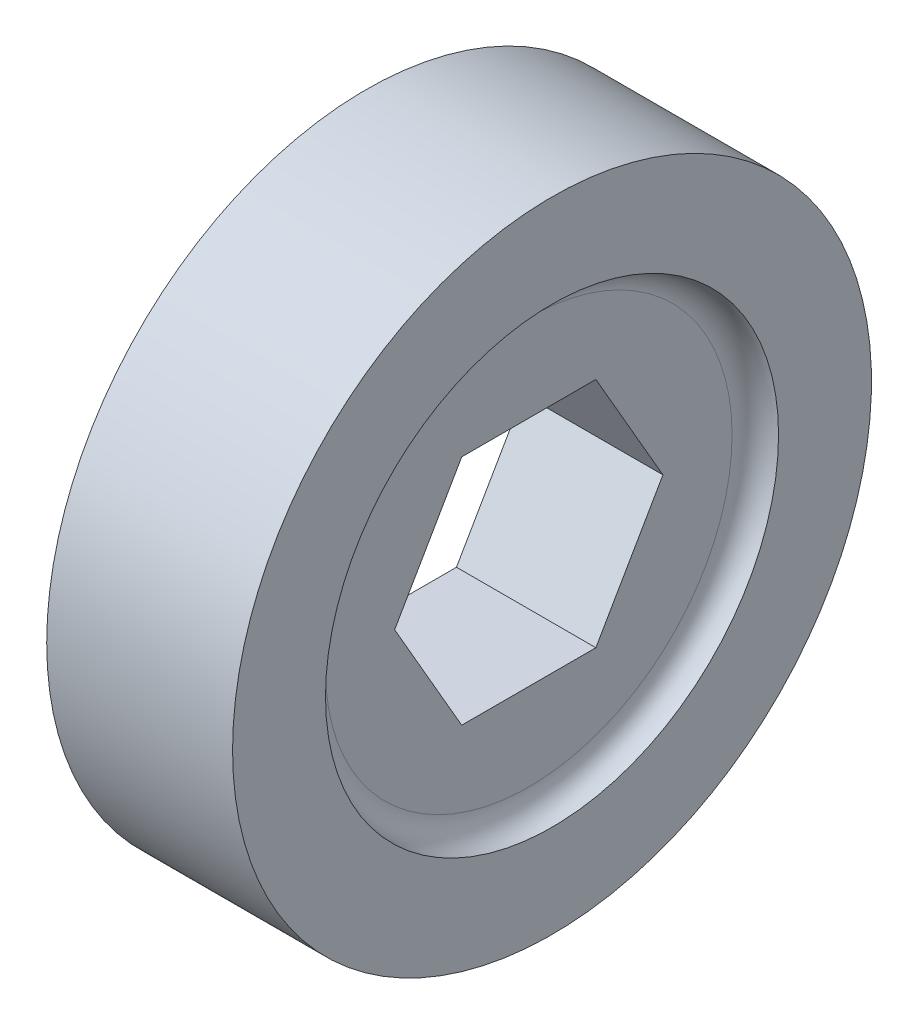
ISO-10303-21;
HEADER;
FILE_DESCRIPTION(('STEP AP214'),'2;1');
FILE_NAME('part.step','',(''),(''),'','','');
FILE_SCHEMA(('AUTOMOTIVE_DESIGN { 1 0 10303 214 1 1 1 1 }'));
ENDSEC;
DATA;
#1=APPLICATION_CONTEXT('core data for automotive mechanical design processes');
#2=APPLICATION_PROTOCOL_DEFINITION('international standard','automotive_design',2000,#1);
#3=PRODUCT_CONTEXT('',#1,'mechanical');
#4=PRODUCT('Part','Part','',(#3));
#5=PRODUCT_RELATED_PRODUCT_CATEGORY('part','',(#4));
#6=PRODUCT_DEFINITION_FORMATION('','',#4);
#7=PRODUCT_DEFINITION_CONTEXT('part definition',#1,'design');
#8=PRODUCT_DEFINITION('design','',#6,#7);
#9=PRODUCT_DEFINITION_SHAPE('','',#8);
#10=(LENGTH_UNIT() NAMED_UNIT(*) SI_UNIT(.MILLI.,.METRE.));
#11=(NAMED_UNIT(*) PLANE_ANGLE_UNIT() SI_UNIT($,.RADIAN.));
#12=(NAMED_UNIT(*) SI_UNIT($,.STERADIAN.) SOLID_ANGLE_UNIT());
#13=UNCERTAINTY_MEASURE_WITH_UNIT(LENGTH_MEASURE(1.E-05),#10,'distance_accuracy_value','');
#14=(GEOMETRIC_REPRESENTATION_CONTEXT(3) GLOBAL_UNCERTAINTY_ASSIGNED_CONTEXT((#13)) GLOBAL_UNIT_ASSIGNED_CONTEXT((#10,
#11,#12)) REPRESENTATION_CONTEXT('',''));
#15=CARTESIAN_POINT('',(0.,0.,0.));
#16=DIRECTION('',(0.,0.,1.));
#17=DIRECTION('',(1.,0.,0.));
#18=AXIS2_PLACEMENT_3D('',#15,#16,#17);
#19=CARTESIAN_POINT('',(-5.08,0.,0.));
#20=DIRECTION('',(1.,0.,0.));
#21=DIRECTION('',(0.,0.,-1.));
#22=AXIS2_PLACEMENT_3D('',#19,#20,#21);
#23=PLANE('',#22);
#24=CARTESIAN_POINT('',(-5.08,0.,0.));
#25=DIRECTION('',(-1.,0.,0.));
#26=DIRECTION('',(0.,0.,1.));
#27=AXIS2_PLACEMENT_3D('',#24,#25,#26);
#28=CIRCLE('',#27,12.3825);
#29=CARTESIAN_POINT('',(-5.08,0.,12.3825));
#30=VERTEX_POINT('',#29);
#31=EDGE_CURVE('E11',#30,#30,#28,.T.);
#32=ORIENTED_EDGE('',*,*,#31,.F.);
#33=EDGE_LOOP('',(#32));
#34=FACE_BOUND('',#33,.T.);
#35=CARTESIAN_POINT('',(-5.08,0.,0.));
#36=DIRECTION('',(-1.,0.,0.));
#37=DIRECTION('',(0.,0.,1.));
#38=AXIS2_PLACEMENT_3D('',#35,#36,#37);
#39=CIRCLE('',#38,17.4625);
#40=CARTESIAN_POINT('',(-5.08,0.,17.4625));
#41=VERTEX_POINT('',#40);
#42=EDGE_CURVE('E105',#41,#41,#39,.T.);
#43=ORIENTED_EDGE('',*,*,#42,.T.);
#44=EDGE_LOOP('',(#43));
#45=FACE_BOUND('',#44,.T.);
#46=ADVANCED_FACE('F39',(#34,#45),#23,.F.);
#47=CARTESIAN_POINT('',(-5.08,0.,0.));
#48=DIRECTION('',(-1.,0.,0.));
#49=DIRECTION('',(0.,0.,1.));
#50=AXIS2_PLACEMENT_3D('',#47,#48,#49);
#51=TOROIDAL_SURFACE('',#50,11.1125,1.27);
#52=CARTESIAN_POINT('',(-3.81,0.,0.));
#53=DIRECTION('',(-1.,0.,0.));
#54=DIRECTION('',(0.,0.,1.));
#55=AXIS2_PLACEMENT_3D('',#52,#53,#54);
#56=CIRCLE('',#55,11.1125);
#57=CARTESIAN_POINT('',(-3.81,0.,11.1125));
#58=VERTEX_POINT('',#57);
#59=EDGE_CURVE('E46',#58,#58,#56,.T.);
#60=ORIENTED_EDGE('',*,*,#59,.F.);
#61=EDGE_LOOP('',(#60));
#62=FACE_BOUND('',#61,.T.);
#63=ORIENTED_EDGE('',*,*,#31,.T.);
#64=EDGE_LOOP('',(#63));
#65=FACE_BOUND('',#64,.T.);
#66=ADVANCED_FACE('F153',(#62,#65),#51,.F.);
#67=CARTESIAN_POINT('',(-3.81,0.,0.));
#68=DIRECTION('',(1.,0.,0.));
#69=DIRECTION('',(0.,0.,-1.));
#70=AXIS2_PLACEMENT_3D('',#67,#68,#69);
#71=PLANE('',#70);
#72=DIRECTION('',(0.,0.,1.));
#73=VECTOR('',#72,1.);
#74=CARTESIAN_POINT('',(-3.81,-6.35,3.66617420935412));
#75=LINE('',#74,#73);
#76=CARTESIAN_POINT('',(-3.81,-6.35,-3.66617420935412));
#77=VERTEX_POINT('',#76);
#78=CARTESIAN_POINT('',(-3.81,-6.35,3.66617420935412));
#79=VERTEX_POINT('',#78);
#80=EDGE_CURVE('E112',#77,#79,#75,.T.);
#81=ORIENTED_EDGE('',*,*,#80,.F.);
#82=DIRECTION('',(0.,-0.866025403784439,0.5));
#83=VECTOR('',#82,1.);
#84=CARTESIAN_POINT('',(-3.81,-6.35,-3.66617420935412));
#85=LINE('',#84,#83);
#86=CARTESIAN_POINT('',(-3.81,0.,-7.33234841870825));
#87=VERTEX_POINT('',#86);
#88=EDGE_CURVE('E93',#87,#77,#85,.T.);
#89=ORIENTED_EDGE('',*,*,#88,.F.);
#90=DIRECTION('',(0.,-0.866025403784439,-0.5));
#91=VECTOR('',#90,1.);
#92=CARTESIAN_POINT('',(-3.81,0.,-7.33234841870825));
#93=LINE('',#92,#91);
#94=CARTESIAN_POINT('',(-3.81,6.35,-3.66617420935412));
#95=VERTEX_POINT('',#94);
#96=EDGE_CURVE('E102',#95,#87,#93,.T.);
#97=ORIENTED_EDGE('',*,*,#96,.F.);
#98=DIRECTION('',(0.,0.,-1.));
#99=VECTOR('',#98,1.);
#100=CARTESIAN_POINT('',(-3.81,6.35,-3.66617420935412));
#101=LINE('',#100,#99);
#102=CARTESIAN_POINT('',(-3.81,6.35,3.66617420935412));
#103=VERTEX_POINT('',#102);
#104=EDGE_CURVE('E53',#103,#95,#101,.T.);
#105=ORIENTED_EDGE('',*,*,#104,.F.);
#106=DIRECTION('',(0.,0.866025403784439,-0.5));
#107=VECTOR('',#106,1.);
#108=CARTESIAN_POINT('',(-3.81,6.35,3.66617420935412));
#109=LINE('',#108,#107);
#110=CARTESIAN_POINT('',(-3.81,0.,7.33234841870825));
#111=VERTEX_POINT('',#110);
#112=EDGE_CURVE('E285',#111,#103,#109,.T.);
#113=ORIENTED_EDGE('',*,*,#112,.F.);
#114=DIRECTION('',(0.,0.866025403784439,0.5));
#115=VECTOR('',#114,1.);
#116=CARTESIAN_POINT('',(-3.81,0.,7.33234841870825));
#117=LINE('',#116,#115);
#118=EDGE_CURVE('E116',#79,#111,#117,.T.);
#119=ORIENTED_EDGE('',*,*,#118,.F.);
#120=EDGE_LOOP('',(#81,#89,#97,#105,#113,#119));
#121=FACE_BOUND('',#120,.T.);
#122=ORIENTED_EDGE('',*,*,#59,.T.);
#123=EDGE_LOOP('',(#122));
#124=FACE_BOUND('',#123,.T.);
#125=ADVANCED_FACE('F108',(#121,#124),#71,.F.);
#126=CARTESIAN_POINT('',(3.81,0.,0.));
#127=DIRECTION('',(1.,0.,0.));
#128=DIRECTION('',(0.,0.,-1.));
#129=AXIS2_PLACEMENT_3D('',#126,#127,#128);
#130=PLANE('',#129);
#131=DIRECTION('',(0.,0.866025403784439,-0.5));
#132=VECTOR('',#131,1.);
#133=CARTESIAN_POINT('',(3.81,-6.35,-3.66617420935412));
#134=LINE('',#133,#132);
#135=CARTESIAN_POINT('',(3.81,-6.35,-3.66617420935412));
#136=VERTEX_POINT('',#135);
#137=CARTESIAN_POINT('',(3.81,0.,-7.33234841870825));
#138=VERTEX_POINT('',#137);
#139=EDGE_CURVE('E61',#136,#138,#134,.T.);
#140=ORIENTED_EDGE('',*,*,#139,.F.);
#141=DIRECTION('',(0.,0.,-1.));
#142=VECTOR('',#141,1.);
#143=CARTESIAN_POINT('',(3.81,-6.35,3.66617420935412));
#144=LINE('',#143,#142);
#145=CARTESIAN_POINT('',(3.81,-6.35,3.66617420935412));
#146=VERTEX_POINT('',#145);
#147=EDGE_CURVE('E99',#146,#136,#144,.T.);
#148=ORIENTED_EDGE('',*,*,#147,.F.);
#149=DIRECTION('',(0.,-0.866025403784439,-0.5));
#150=VECTOR('',#149,1.);
#151=CARTESIAN_POINT('',(3.81,0.,7.33234841870825));
#152=LINE('',#151,#150);
#153=CARTESIAN_POINT('',(3.81,0.,7.33234841870825));
#154=VERTEX_POINT('',#153);
#155=EDGE_CURVE('E127',#154,#146,#152,.T.);
#156=ORIENTED_EDGE('',*,*,#155,.F.);
#157=DIRECTION('',(0.,-0.866025403784439,0.5));
#158=VECTOR('',#157,1.);
#159=CARTESIAN_POINT('',(3.81,6.35,3.66617420935412));
#160=LINE('',#159,#158);
#161=CARTESIAN_POINT('',(3.81,6.35,3.66617420935412));
#162=VERTEX_POINT('',#161);
#163=EDGE_CURVE('E124',#162,#154,#160,.T.);
#164=ORIENTED_EDGE('',*,*,#163,.F.);
#165=DIRECTION('',(0.,0.,1.));
#166=VECTOR('',#165,1.);
#167=CARTESIAN_POINT('',(3.81,6.35,-3.66617420935412));
#168=LINE('',#167,#166);
#169=CARTESIAN_POINT('',(3.81,6.35,-3.66617420935412));
#170=VERTEX_POINT('',#169);
#171=EDGE_CURVE('E121',#170,#162,#168,.T.);
#172=ORIENTED_EDGE('',*,*,#171,.F.);
#173=DIRECTION('',(0.,0.866025403784438,0.5));
#174=VECTOR('',#173,1.);
#175=CARTESIAN_POINT('',(3.81,0.,-7.33234841870825));
#176=LINE('',#175,#174);
#177=EDGE_CURVE('E114',#138,#170,#176,.T.);
#178=ORIENTED_EDGE('',*,*,#177,.F.);
#179=EDGE_LOOP('',(#140,#148,#156,#164,#172,#178));
#180=FACE_BOUND('',#179,.T.);
#181=CARTESIAN_POINT('',(3.81,0.,0.));
#182=DIRECTION('',(-1.,0.,0.));
#183=DIRECTION('',(0.,0.,1.));
#184=AXIS2_PLACEMENT_3D('',#181,#182,#183);
#185=CIRCLE('',#184,11.1125);
#186=CARTESIAN_POINT('',(3.81,0.,11.1125));
#187=VERTEX_POINT('',#186);
#188=EDGE_CURVE('E148',#187,#187,#185,.T.);
#189=ORIENTED_EDGE('',*,*,#188,.F.);
#190=EDGE_LOOP('',(#189));
#191=FACE_BOUND('',#190,.T.);
#192=ADVANCED_FACE('F180',(#180,#191),#130,.T.);
#193=CARTESIAN_POINT('',(5.08,0.,0.));
#194=DIRECTION('',(-1.,0.,0.));
#195=DIRECTION('',(0.,0.,1.));
#196=AXIS2_PLACEMENT_3D('',#193,#194,#195);
#197=TOROIDAL_SURFACE('',#196,11.1125,1.27);
#198=ORIENTED_EDGE('',*,*,#188,.T.);
#199=EDGE_LOOP('',(#198));
#200=FACE_BOUND('',#199,.T.);
#201=CARTESIAN_POINT('',(5.08,0.,0.));
#202=DIRECTION('',(-1.,0.,0.));
#203=DIRECTION('',(0.,0.,1.));
#204=AXIS2_PLACEMENT_3D('',#201,#202,#203);
#205=CIRCLE('',#204,12.3825);
#206=CARTESIAN_POINT('',(5.08,0.,12.3825));
#207=VERTEX_POINT('',#206);
#208=EDGE_CURVE('E145',#207,#207,#205,.T.);
#209=ORIENTED_EDGE('',*,*,#208,.F.);
#210=EDGE_LOOP('',(#209));
#211=FACE_BOUND('',#210,.T.);
#212=ADVANCED_FACE('F173',(#200,#211),#197,.F.);
#213=CARTESIAN_POINT('',(5.08,0.,0.));
#214=DIRECTION('',(1.,0.,0.));
#215=DIRECTION('',(0.,0.,-1.));
#216=AXIS2_PLACEMENT_3D('',#213,#214,#215);
#217=PLANE('',#216);
#218=ORIENTED_EDGE('',*,*,#208,.T.);
#219=EDGE_LOOP('',(#218));
#220=FACE_BOUND('',#219,.T.);
#221=CARTESIAN_POINT('',(5.08,0.,0.));
#222=DIRECTION('',(-1.,0.,0.));
#223=DIRECTION('',(0.,0.,1.));
#224=AXIS2_PLACEMENT_3D('',#221,#222,#223);
#225=CIRCLE('',#224,17.4625);
#226=CARTESIAN_POINT('',(5.08,0.,17.4625));
#227=VERTEX_POINT('',#226);
#228=EDGE_CURVE('E142',#227,#227,#225,.T.);
#229=ORIENTED_EDGE('',*,*,#228,.F.);
#230=EDGE_LOOP('',(#229));
#231=FACE_BOUND('',#230,.T.);
#232=ADVANCED_FACE('F164',(#220,#231),#217,.T.);
#233=CARTESIAN_POINT('',(-6.86942909494839,0.,0.));
#234=DIRECTION('',(-1.,0.,0.));
#235=DIRECTION('',(0.,0.,1.));
#236=AXIS2_PLACEMENT_3D('',#233,#234,#235);
#237=CYLINDRICAL_SURFACE('',#236,17.4625);
#238=ORIENTED_EDGE('',*,*,#228,.T.);
#239=EDGE_LOOP('',(#238));
#240=FACE_BOUND('',#239,.T.);
#241=ORIENTED_EDGE('',*,*,#42,.F.);
#242=EDGE_LOOP('',(#241));
#243=FACE_BOUND('',#242,.T.);
#244=ADVANCED_FACE('F162',(#240,#243),#237,.T.);
#245=CARTESIAN_POINT('',(-5.081,-6.35,-3.66617420935412));
#246=DIRECTION('',(0.,-0.5,-0.866025403784439));
#247=DIRECTION('',(0.,0.866025403784439,-0.5));
#248=AXIS2_PLACEMENT_3D('',#245,#246,#247);
#249=PLANE('',#248);
#250=ORIENTED_EDGE('',*,*,#88,.T.);
#251=DIRECTION('',(1.,0.,0.));
#252=VECTOR('',#251,1.);
#253=CARTESIAN_POINT('',(-5.081,-6.35,-3.66617420935412));
#254=LINE('',#253,#252);
#255=EDGE_CURVE('E106',#77,#136,#254,.T.);
#256=ORIENTED_EDGE('',*,*,#255,.T.);
#257=ORIENTED_EDGE('',*,*,#139,.T.);
#258=DIRECTION('',(1.,0.,0.));
#259=VECTOR('',#258,1.);
#260=CARTESIAN_POINT('',(-5.081,0.,-7.33234841870825));
#261=LINE('',#260,#259);
#262=EDGE_CURVE('E89',#87,#138,#261,.T.);
#263=ORIENTED_EDGE('',*,*,#262,.F.);
#264=EDGE_LOOP('',(#250,#256,#257,#263));
#265=FACE_BOUND('',#264,.T.);
#266=ADVANCED_FACE('F91',(#265),#249,.F.);
#267=CARTESIAN_POINT('',(-5.081,-6.35,3.66617420935412));
#268=DIRECTION('',(0.,-1.,0.));
#269=DIRECTION('',(0.,0.,-1.));
#270=AXIS2_PLACEMENT_3D('',#267,#268,#269);
#271=PLANE('',#270);
#272=ORIENTED_EDGE('',*,*,#80,.T.);
#273=DIRECTION('',(1.,0.,0.));
#274=VECTOR('',#273,1.);
#275=CARTESIAN_POINT('',(-5.081,-6.35,3.66617420935412));
#276=LINE('',#275,#274);
#277=EDGE_CURVE('E133',#79,#146,#276,.T.);
#278=ORIENTED_EDGE('',*,*,#277,.T.);
#279=ORIENTED_EDGE('',*,*,#147,.T.);
#280=ORIENTED_EDGE('',*,*,#255,.F.);
#281=EDGE_LOOP('',(#272,#278,#279,#280));
#282=FACE_BOUND('',#281,.T.);
#283=ADVANCED_FACE('F171',(#282),#271,.F.);
#284=CARTESIAN_POINT('',(-5.081,0.,7.33234841870825));
#285=DIRECTION('',(0.,-0.5,0.866025403784439));
#286=DIRECTION('',(0.,-0.866025403784439,-0.5));
#287=AXIS2_PLACEMENT_3D('',#284,#285,#286);
#288=PLANE('',#287);
#289=ORIENTED_EDGE('',*,*,#118,.T.);
#290=DIRECTION('',(1.,0.,0.));
#291=VECTOR('',#290,1.);
#292=CARTESIAN_POINT('',(-5.081,0.,7.33234841870825));
#293=LINE('',#292,#291);
#294=EDGE_CURVE('E135',#111,#154,#293,.T.);
#295=ORIENTED_EDGE('',*,*,#294,.T.);
#296=ORIENTED_EDGE('',*,*,#155,.T.);
#297=ORIENTED_EDGE('',*,*,#277,.F.);
#298=EDGE_LOOP('',(#289,#295,#296,#297));
#299=FACE_BOUND('',#298,.T.);
#300=ADVANCED_FACE('F243',(#299),#288,.F.);
#301=CARTESIAN_POINT('',(-5.081,6.35,3.66617420935412));
#302=DIRECTION('',(0.,0.5,0.866025403784439));
#303=DIRECTION('',(0.,-0.866025403784439,0.5));
#304=AXIS2_PLACEMENT_3D('',#301,#302,#303);
#305=PLANE('',#304);
#306=ORIENTED_EDGE('',*,*,#112,.T.);
#307=DIRECTION('',(1.,0.,0.));
#308=VECTOR('',#307,1.);
#309=CARTESIAN_POINT('',(-5.081,6.35,3.66617420935412));
#310=LINE('',#309,#308);
#311=EDGE_CURVE('E137',#103,#162,#310,.T.);
#312=ORIENTED_EDGE('',*,*,#311,.T.);
#313=ORIENTED_EDGE('',*,*,#163,.T.);
#314=ORIENTED_EDGE('',*,*,#294,.F.);
#315=EDGE_LOOP('',(#306,#312,#313,#314));
#316=FACE_BOUND('',#315,.T.);
#317=ADVANCED_FACE('F252',(#316),#305,.F.);
#318=CARTESIAN_POINT('',(-5.081,6.35,-3.66617420935412));
#319=DIRECTION('',(0.,1.,0.));
#320=DIRECTION('',(0.,0.,1.));
#321=AXIS2_PLACEMENT_3D('',#318,#319,#320);
#322=PLANE('',#321);
#323=ORIENTED_EDGE('',*,*,#104,.T.);
#324=DIRECTION('',(1.,0.,0.));
#325=VECTOR('',#324,1.);
#326=CARTESIAN_POINT('',(-5.081,6.35,-3.66617420935412));
#327=LINE('',#326,#325);
#328=EDGE_CURVE('E98',#95,#170,#327,.T.);
#329=ORIENTED_EDGE('',*,*,#328,.T.);
#330=ORIENTED_EDGE('',*,*,#171,.T.);
#331=ORIENTED_EDGE('',*,*,#311,.F.);
#332=EDGE_LOOP('',(#323,#329,#330,#331));
#333=FACE_BOUND('',#332,.T.);
#334=ADVANCED_FACE('F261',(#333),#322,.F.);
#335=CARTESIAN_POINT('',(-5.081,0.,-7.33234841870825));
#336=DIRECTION('',(0.,0.5,-0.866025403784439));
#337=DIRECTION('',(0.,0.866025403784439,0.5));
#338=AXIS2_PLACEMENT_3D('',#335,#336,#337);
#339=PLANE('',#338);
#340=ORIENTED_EDGE('',*,*,#96,.T.);
#341=ORIENTED_EDGE('',*,*,#262,.T.);
#342=ORIENTED_EDGE('',*,*,#177,.T.);
#343=ORIENTED_EDGE('',*,*,#328,.F.);
#344=EDGE_LOOP('',(#340,#341,#342,#343));
#345=FACE_BOUND('',#344,.T.);
#346=ADVANCED_FACE('F103',(#345),#339,.F.);
#347=CLOSED_SHELL('',(#46,#66,#125,#192,#212,#232,#244,#266,#283,#300,#317,#334,#346));
#348=MANIFOLD_SOLID_BREP('B2',#347);
#349=ADVANCED_BREP_SHAPE_REPRESENTATION('',(#18,#348),#14);
#350=SHAPE_DEFINITION_REPRESENTATION(#9,#349);
ENDSEC;
END-ISO-10303-21;
